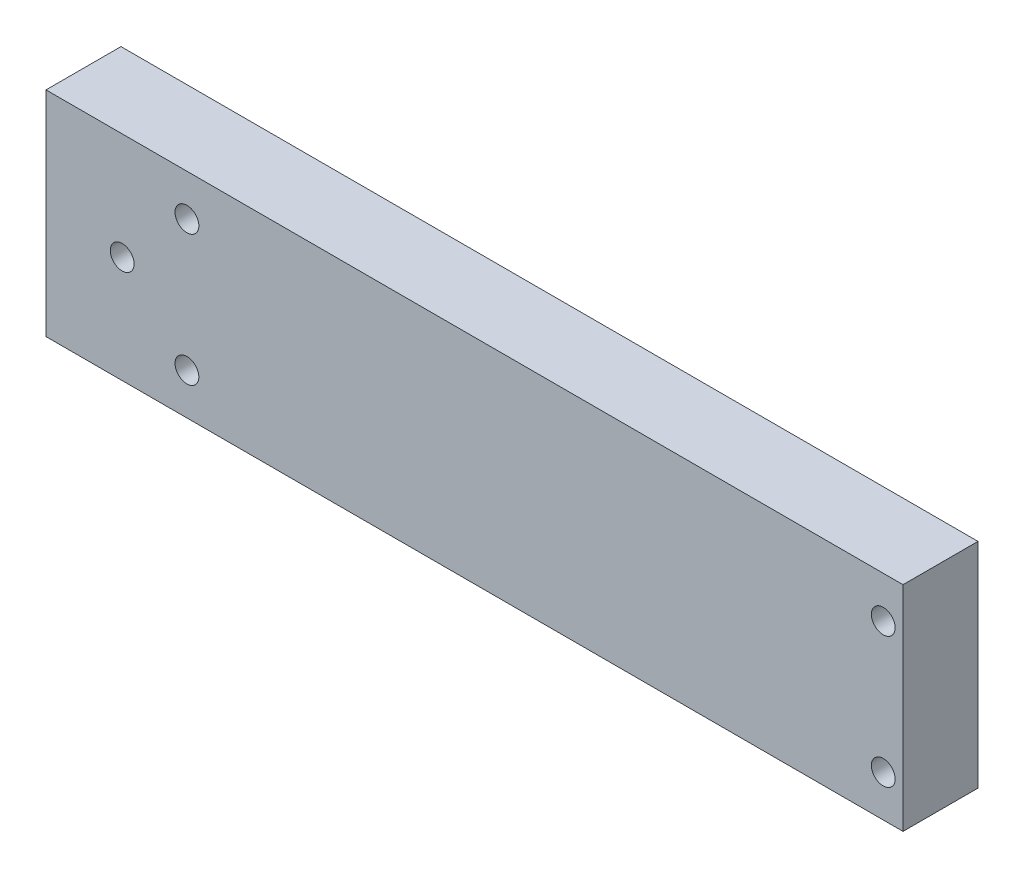
ISO-10303-21;
HEADER;
FILE_DESCRIPTION(('STEP AP214'),'2;1');
FILE_NAME('part.step','',(''),(''),'','','');
FILE_SCHEMA(('AUTOMOTIVE_DESIGN { 1 0 10303 214 1 1 1 1 }'));
ENDSEC;
DATA;
#1=APPLICATION_CONTEXT('core data for automotive mechanical design processes');
#2=APPLICATION_PROTOCOL_DEFINITION('international standard','automotive_design',2000,#1);
#3=PRODUCT_CONTEXT('',#1,'mechanical');
#4=PRODUCT('Part','Part','',(#3));
#5=PRODUCT_RELATED_PRODUCT_CATEGORY('part','',(#4));
#6=PRODUCT_DEFINITION_FORMATION('','',#4);
#7=PRODUCT_DEFINITION_CONTEXT('part definition',#1,'design');
#8=PRODUCT_DEFINITION('design','',#6,#7);
#9=PRODUCT_DEFINITION_SHAPE('','',#8);
#10=(LENGTH_UNIT() NAMED_UNIT(*) SI_UNIT(.MILLI.,.METRE.));
#11=(NAMED_UNIT(*) PLANE_ANGLE_UNIT() SI_UNIT($,.RADIAN.));
#12=(NAMED_UNIT(*) SI_UNIT($,.STERADIAN.) SOLID_ANGLE_UNIT());
#13=UNCERTAINTY_MEASURE_WITH_UNIT(LENGTH_MEASURE(1.E-05),#10,'distance_accuracy_value','');
#14=(GEOMETRIC_REPRESENTATION_CONTEXT(3) GLOBAL_UNCERTAINTY_ASSIGNED_CONTEXT((#13)) GLOBAL_UNIT_ASSIGNED_CONTEXT((#10,
#11,#12)) REPRESENTATION_CONTEXT('',''));
#15=CARTESIAN_POINT('',(0.,0.,0.));
#16=DIRECTION('',(0.,0.,1.));
#17=DIRECTION('',(1.,0.,0.));
#18=AXIS2_PLACEMENT_3D('',#15,#16,#17);
#19=CARTESIAN_POINT('',(0.,0.,0.));
#20=DIRECTION('',(0.,0.,-1.));
#21=DIRECTION('',(-1.,0.,0.));
#22=AXIS2_PLACEMENT_3D('',#19,#20,#21);
#23=PLANE('',#22);
#24=DIRECTION('',(0.,-1.,0.));
#25=VECTOR('',#24,1.);
#26=CARTESIAN_POINT('',(0.,0.,0.));
#27=LINE('',#26,#25);
#28=CARTESIAN_POINT('',(0.,28.5,0.));
#29=VERTEX_POINT('',#28);
#30=CARTESIAN_POINT('',(0.,0.,0.));
#31=VERTEX_POINT('',#30);
#32=EDGE_CURVE('E103',#29,#31,#27,.T.);
#33=ORIENTED_EDGE('',*,*,#32,.F.);
#34=DIRECTION('',(-1.,0.,0.));
#35=VECTOR('',#34,1.);
#36=CARTESIAN_POINT('',(0.,28.5,0.));
#37=LINE('',#36,#35);
#38=CARTESIAN_POINT('',(114.3,28.5,0.));
#39=VERTEX_POINT('',#38);
#40=EDGE_CURVE('E79',#39,#29,#37,.T.);
#41=ORIENTED_EDGE('',*,*,#40,.F.);
#42=DIRECTION('',(0.,1.,0.));
#43=VECTOR('',#42,1.);
#44=CARTESIAN_POINT('',(114.3,0.,0.));
#45=LINE('',#44,#43);
#46=CARTESIAN_POINT('',(114.3,0.,0.));
#47=VERTEX_POINT('',#46);
#48=EDGE_CURVE('E73',#47,#39,#45,.T.);
#49=ORIENTED_EDGE('',*,*,#48,.F.);
#50=DIRECTION('',(1.,0.,0.));
#51=VECTOR('',#50,1.);
#52=CARTESIAN_POINT('',(0.,0.,0.));
#53=LINE('',#52,#51);
#54=EDGE_CURVE('E95',#31,#47,#53,.T.);
#55=ORIENTED_EDGE('',*,*,#54,.F.);
#56=EDGE_LOOP('',(#33,#41,#49,#55));
#57=FACE_BOUND('',#56,.T.);
#58=CARTESIAN_POINT('',(10.16,14.25,0.));
#59=DIRECTION('',(0.,0.,1.));
#60=DIRECTION('',(1.,0.,0.));
#61=AXIS2_PLACEMENT_3D('',#58,#59,#60);
#62=CIRCLE('',#61,1.58750000000001);
#63=CARTESIAN_POINT('',(11.7475,14.25,0.));
#64=VERTEX_POINT('',#63);
#65=EDGE_CURVE('E106',#64,#64,#62,.T.);
#66=ORIENTED_EDGE('',*,*,#65,.T.);
#67=EDGE_LOOP('',(#66));
#68=FACE_BOUND('',#67,.T.);
#69=CARTESIAN_POINT('',(111.665004,22.98125,0.));
#70=DIRECTION('',(0.,0.,1.));
#71=DIRECTION('',(1.,0.,0.));
#72=AXIS2_PLACEMENT_3D('',#69,#70,#71);
#73=CIRCLE('',#72,1.58750000000001);
#74=CARTESIAN_POINT('',(113.252504,22.98125,0.));
#75=VERTEX_POINT('',#74);
#76=EDGE_CURVE('E122',#75,#75,#73,.T.);
#77=ORIENTED_EDGE('',*,*,#76,.T.);
#78=EDGE_LOOP('',(#77));
#79=FACE_BOUND('',#78,.T.);
#80=CARTESIAN_POINT('',(18.796,22.98125,0.));
#81=DIRECTION('',(0.,0.,1.));
#82=DIRECTION('',(1.,0.,0.));
#83=AXIS2_PLACEMENT_3D('',#80,#81,#82);
#84=CIRCLE('',#83,1.58750000000001);
#85=CARTESIAN_POINT('',(20.3835,22.98125,0.));
#86=VERTEX_POINT('',#85);
#87=EDGE_CURVE('E128',#86,#86,#84,.T.);
#88=ORIENTED_EDGE('',*,*,#87,.T.);
#89=EDGE_LOOP('',(#88));
#90=FACE_BOUND('',#89,.T.);
#91=CARTESIAN_POINT('',(111.665004,5.51875,0.));
#92=DIRECTION('',(0.,0.,1.));
#93=DIRECTION('',(1.,0.,0.));
#94=AXIS2_PLACEMENT_3D('',#91,#92,#93);
#95=CIRCLE('',#94,1.58750000000001);
#96=CARTESIAN_POINT('',(113.252504,5.51875,0.));
#97=VERTEX_POINT('',#96);
#98=EDGE_CURVE('E134',#97,#97,#95,.T.);
#99=ORIENTED_EDGE('',*,*,#98,.T.);
#100=EDGE_LOOP('',(#99));
#101=FACE_BOUND('',#100,.T.);
#102=CARTESIAN_POINT('',(18.796,5.51875,0.));
#103=DIRECTION('',(0.,0.,1.));
#104=DIRECTION('',(1.,0.,0.));
#105=AXIS2_PLACEMENT_3D('',#102,#103,#104);
#106=CIRCLE('',#105,1.58750000000001);
#107=CARTESIAN_POINT('',(20.3835,5.51875,0.));
#108=VERTEX_POINT('',#107);
#109=EDGE_CURVE('E140',#108,#108,#106,.T.);
#110=ORIENTED_EDGE('',*,*,#109,.T.);
#111=EDGE_LOOP('',(#110));
#112=FACE_BOUND('',#111,.T.);
#113=ADVANCED_FACE('F39',(#57,#68,#79,#90,#101,#112),#23,.T.);
#114=CARTESIAN_POINT('',(0.,0.,10.));
#115=DIRECTION('',(1.,0.,0.));
#116=DIRECTION('',(0.,0.,-1.));
#117=AXIS2_PLACEMENT_3D('',#114,#115,#116);
#118=PLANE('',#117);
#119=ORIENTED_EDGE('',*,*,#32,.T.);
#120=DIRECTION('',(0.,0.,-1.));
#121=VECTOR('',#120,1.);
#122=CARTESIAN_POINT('',(0.,0.,10.));
#123=LINE('',#122,#121);
#124=CARTESIAN_POINT('',(0.,0.,10.));
#125=VERTEX_POINT('',#124);
#126=EDGE_CURVE('E11',#125,#31,#123,.T.);
#127=ORIENTED_EDGE('',*,*,#126,.F.);
#128=DIRECTION('',(0.,-1.,0.));
#129=VECTOR('',#128,1.);
#130=CARTESIAN_POINT('',(0.,0.,10.));
#131=LINE('',#130,#129);
#132=CARTESIAN_POINT('',(0.,28.5,10.));
#133=VERTEX_POINT('',#132);
#134=EDGE_CURVE('E91',#133,#125,#131,.T.);
#135=ORIENTED_EDGE('',*,*,#134,.F.);
#136=DIRECTION('',(0.,0.,-1.));
#137=VECTOR('',#136,1.);
#138=CARTESIAN_POINT('',(0.,28.5,10.));
#139=LINE('',#138,#137);
#140=EDGE_CURVE('E99',#133,#29,#139,.T.);
#141=ORIENTED_EDGE('',*,*,#140,.T.);
#142=EDGE_LOOP('',(#119,#127,#135,#141));
#143=FACE_BOUND('',#142,.T.);
#144=ADVANCED_FACE('F41',(#143),#118,.F.);
#145=CARTESIAN_POINT('',(0.,0.,10.));
#146=DIRECTION('',(0.,1.,0.));
#147=DIRECTION('',(0.,0.,1.));
#148=AXIS2_PLACEMENT_3D('',#145,#146,#147);
#149=PLANE('',#148);
#150=ORIENTED_EDGE('',*,*,#54,.T.);
#151=DIRECTION('',(0.,0.,-1.));
#152=VECTOR('',#151,1.);
#153=CARTESIAN_POINT('',(114.3,0.,10.));
#154=LINE('',#153,#152);
#155=CARTESIAN_POINT('',(114.3,0.,10.));
#156=VERTEX_POINT('',#155);
#157=EDGE_CURVE('E48',#156,#47,#154,.T.);
#158=ORIENTED_EDGE('',*,*,#157,.F.);
#159=DIRECTION('',(1.,0.,0.));
#160=VECTOR('',#159,1.);
#161=CARTESIAN_POINT('',(0.,0.,10.));
#162=LINE('',#161,#160);
#163=EDGE_CURVE('E86',#125,#156,#162,.T.);
#164=ORIENTED_EDGE('',*,*,#163,.F.);
#165=ORIENTED_EDGE('',*,*,#126,.T.);
#166=EDGE_LOOP('',(#150,#158,#164,#165));
#167=FACE_BOUND('',#166,.T.);
#168=ADVANCED_FACE('F94',(#167),#149,.F.);
#169=CARTESIAN_POINT('',(114.3,0.,10.));
#170=DIRECTION('',(-1.,0.,0.));
#171=DIRECTION('',(0.,0.,1.));
#172=AXIS2_PLACEMENT_3D('',#169,#170,#171);
#173=PLANE('',#172);
#174=ORIENTED_EDGE('',*,*,#48,.T.);
#175=DIRECTION('',(0.,0.,-1.));
#176=VECTOR('',#175,1.);
#177=CARTESIAN_POINT('',(114.3,28.5,10.));
#178=LINE('',#177,#176);
#179=CARTESIAN_POINT('',(114.3,28.5,10.));
#180=VERTEX_POINT('',#179);
#181=EDGE_CURVE('E96',#180,#39,#178,.T.);
#182=ORIENTED_EDGE('',*,*,#181,.F.);
#183=DIRECTION('',(0.,1.,0.));
#184=VECTOR('',#183,1.);
#185=CARTESIAN_POINT('',(114.3,0.,10.));
#186=LINE('',#185,#184);
#187=EDGE_CURVE('E89',#156,#180,#186,.T.);
#188=ORIENTED_EDGE('',*,*,#187,.F.);
#189=ORIENTED_EDGE('',*,*,#157,.T.);
#190=EDGE_LOOP('',(#174,#182,#188,#189));
#191=FACE_BOUND('',#190,.T.);
#192=ADVANCED_FACE('F97',(#191),#173,.F.);
#193=CARTESIAN_POINT('',(0.,28.5,10.));
#194=DIRECTION('',(0.,-1.,0.));
#195=DIRECTION('',(0.,0.,-1.));
#196=AXIS2_PLACEMENT_3D('',#193,#194,#195);
#197=PLANE('',#196);
#198=ORIENTED_EDGE('',*,*,#40,.T.);
#199=ORIENTED_EDGE('',*,*,#140,.F.);
#200=DIRECTION('',(-1.,0.,0.));
#201=VECTOR('',#200,1.);
#202=CARTESIAN_POINT('',(0.,28.5,10.));
#203=LINE('',#202,#201);
#204=EDGE_CURVE('E56',#180,#133,#203,.T.);
#205=ORIENTED_EDGE('',*,*,#204,.F.);
#206=ORIENTED_EDGE('',*,*,#181,.T.);
#207=EDGE_LOOP('',(#198,#199,#205,#206));
#208=FACE_BOUND('',#207,.T.);
#209=ADVANCED_FACE('F111',(#208),#197,.F.);
#210=CARTESIAN_POINT('',(0.,0.,10.));
#211=DIRECTION('',(0.,0.,-1.));
#212=DIRECTION('',(-1.,0.,0.));
#213=AXIS2_PLACEMENT_3D('',#210,#211,#212);
#214=PLANE('',#213);
#215=CARTESIAN_POINT('',(18.796,5.51875,10.));
#216=DIRECTION('',(0.,0.,1.));
#217=DIRECTION('',(1.,0.,0.));
#218=AXIS2_PLACEMENT_3D('',#215,#216,#217);
#219=CIRCLE('',#218,1.58750000000001);
#220=CARTESIAN_POINT('',(20.3835,5.51875,10.));
#221=VERTEX_POINT('',#220);
#222=EDGE_CURVE('E143',#221,#221,#219,.T.);
#223=ORIENTED_EDGE('',*,*,#222,.F.);
#224=EDGE_LOOP('',(#223));
#225=FACE_BOUND('',#224,.T.);
#226=CARTESIAN_POINT('',(111.665004,5.51875,10.));
#227=DIRECTION('',(0.,0.,1.));
#228=DIRECTION('',(1.,0.,0.));
#229=AXIS2_PLACEMENT_3D('',#226,#227,#228);
#230=CIRCLE('',#229,1.58750000000002);
#231=CARTESIAN_POINT('',(113.252504,5.51875,10.));
#232=VERTEX_POINT('',#231);
#233=EDGE_CURVE('E137',#232,#232,#230,.T.);
#234=ORIENTED_EDGE('',*,*,#233,.F.);
#235=EDGE_LOOP('',(#234));
#236=FACE_BOUND('',#235,.T.);
#237=CARTESIAN_POINT('',(18.796,22.98125,10.));
#238=DIRECTION('',(0.,0.,1.));
#239=DIRECTION('',(1.,0.,0.));
#240=AXIS2_PLACEMENT_3D('',#237,#238,#239);
#241=CIRCLE('',#240,1.58750000000001);
#242=CARTESIAN_POINT('',(20.3835,22.98125,10.));
#243=VERTEX_POINT('',#242);
#244=EDGE_CURVE('E131',#243,#243,#241,.T.);
#245=ORIENTED_EDGE('',*,*,#244,.F.);
#246=EDGE_LOOP('',(#245));
#247=FACE_BOUND('',#246,.T.);
#248=CARTESIAN_POINT('',(111.665004,22.98125,10.));
#249=DIRECTION('',(0.,0.,1.));
#250=DIRECTION('',(1.,0.,0.));
#251=AXIS2_PLACEMENT_3D('',#248,#249,#250);
#252=CIRCLE('',#251,1.58750000000002);
#253=CARTESIAN_POINT('',(113.252504,22.98125,10.));
#254=VERTEX_POINT('',#253);
#255=EDGE_CURVE('E125',#254,#254,#252,.T.);
#256=ORIENTED_EDGE('',*,*,#255,.F.);
#257=EDGE_LOOP('',(#256));
#258=FACE_BOUND('',#257,.T.);
#259=CARTESIAN_POINT('',(10.16,14.25,10.));
#260=DIRECTION('',(0.,0.,1.));
#261=DIRECTION('',(1.,0.,0.));
#262=AXIS2_PLACEMENT_3D('',#259,#260,#261);
#263=CIRCLE('',#262,1.58750000000001);
#264=CARTESIAN_POINT('',(11.7475,14.25,10.));
#265=VERTEX_POINT('',#264);
#266=EDGE_CURVE('E119',#265,#265,#263,.T.);
#267=ORIENTED_EDGE('',*,*,#266,.F.);
#268=EDGE_LOOP('',(#267));
#269=FACE_BOUND('',#268,.T.);
#270=ORIENTED_EDGE('',*,*,#134,.T.);
#271=ORIENTED_EDGE('',*,*,#163,.T.);
#272=ORIENTED_EDGE('',*,*,#187,.T.);
#273=ORIENTED_EDGE('',*,*,#204,.T.);
#274=EDGE_LOOP('',(#270,#271,#272,#273));
#275=FACE_BOUND('',#274,.T.);
#276=ADVANCED_FACE('F87',(#225,#236,#247,#258,#269,#275),#214,.F.);
#277=CARTESIAN_POINT('',(10.16,14.25,10.));
#278=DIRECTION('',(0.,0.,1.));
#279=DIRECTION('',(1.,0.,0.));
#280=AXIS2_PLACEMENT_3D('',#277,#278,#279);
#281=CYLINDRICAL_SURFACE('',#280,1.58750000000001);
#282=ORIENTED_EDGE('',*,*,#65,.F.);
#283=EDGE_LOOP('',(#282));
#284=FACE_BOUND('',#283,.T.);
#285=ORIENTED_EDGE('',*,*,#266,.T.);
#286=EDGE_LOOP('',(#285));
#287=FACE_BOUND('',#286,.T.);
#288=ADVANCED_FACE('F151',(#284,#287),#281,.F.);
#289=CARTESIAN_POINT('',(111.665004,22.98125,10.));
#290=DIRECTION('',(0.,0.,1.));
#291=DIRECTION('',(1.,0.,0.));
#292=AXIS2_PLACEMENT_3D('',#289,#290,#291);
#293=CYLINDRICAL_SURFACE('',#292,1.58750000000001);
#294=ORIENTED_EDGE('',*,*,#76,.F.);
#295=EDGE_LOOP('',(#294));
#296=FACE_BOUND('',#295,.T.);
#297=ORIENTED_EDGE('',*,*,#255,.T.);
#298=EDGE_LOOP('',(#297));
#299=FACE_BOUND('',#298,.T.);
#300=ADVANCED_FACE('F162',(#296,#299),#293,.F.);
#301=CARTESIAN_POINT('',(18.796,22.98125,10.));
#302=DIRECTION('',(0.,0.,1.));
#303=DIRECTION('',(1.,0.,0.));
#304=AXIS2_PLACEMENT_3D('',#301,#302,#303);
#305=CYLINDRICAL_SURFACE('',#304,1.58750000000001);
#306=ORIENTED_EDGE('',*,*,#87,.F.);
#307=EDGE_LOOP('',(#306));
#308=FACE_BOUND('',#307,.T.);
#309=ORIENTED_EDGE('',*,*,#244,.T.);
#310=EDGE_LOOP('',(#309));
#311=FACE_BOUND('',#310,.T.);
#312=ADVANCED_FACE('F169',(#308,#311),#305,.F.);
#313=CARTESIAN_POINT('',(111.665004,5.51875,10.));
#314=DIRECTION('',(0.,0.,1.));
#315=DIRECTION('',(1.,0.,0.));
#316=AXIS2_PLACEMENT_3D('',#313,#314,#315);
#317=CYLINDRICAL_SURFACE('',#316,1.58750000000001);
#318=ORIENTED_EDGE('',*,*,#98,.F.);
#319=EDGE_LOOP('',(#318));
#320=FACE_BOUND('',#319,.T.);
#321=ORIENTED_EDGE('',*,*,#233,.T.);
#322=EDGE_LOOP('',(#321));
#323=FACE_BOUND('',#322,.T.);
#324=ADVANCED_FACE('F223',(#320,#323),#317,.F.);
#325=CARTESIAN_POINT('',(18.796,5.51875,10.));
#326=DIRECTION('',(0.,0.,1.));
#327=DIRECTION('',(1.,0.,0.));
#328=AXIS2_PLACEMENT_3D('',#325,#326,#327);
#329=CYLINDRICAL_SURFACE('',#328,1.58750000000001);
#330=ORIENTED_EDGE('',*,*,#109,.F.);
#331=EDGE_LOOP('',(#330));
#332=FACE_BOUND('',#331,.T.);
#333=ORIENTED_EDGE('',*,*,#222,.T.);
#334=EDGE_LOOP('',(#333));
#335=FACE_BOUND('',#334,.T.);
#336=ADVANCED_FACE('F147',(#332,#335),#329,.F.);
#337=CLOSED_SHELL('',(#113,#144,#168,#192,#209,#276,#288,#300,#312,#324,#336));
#338=MANIFOLD_SOLID_BREP('B2',#337);
#339=ADVANCED_BREP_SHAPE_REPRESENTATION('',(#18,#338),#14);
#340=SHAPE_DEFINITION_REPRESENTATION(#9,#339);
ENDSEC;
END-ISO-10303-21;
